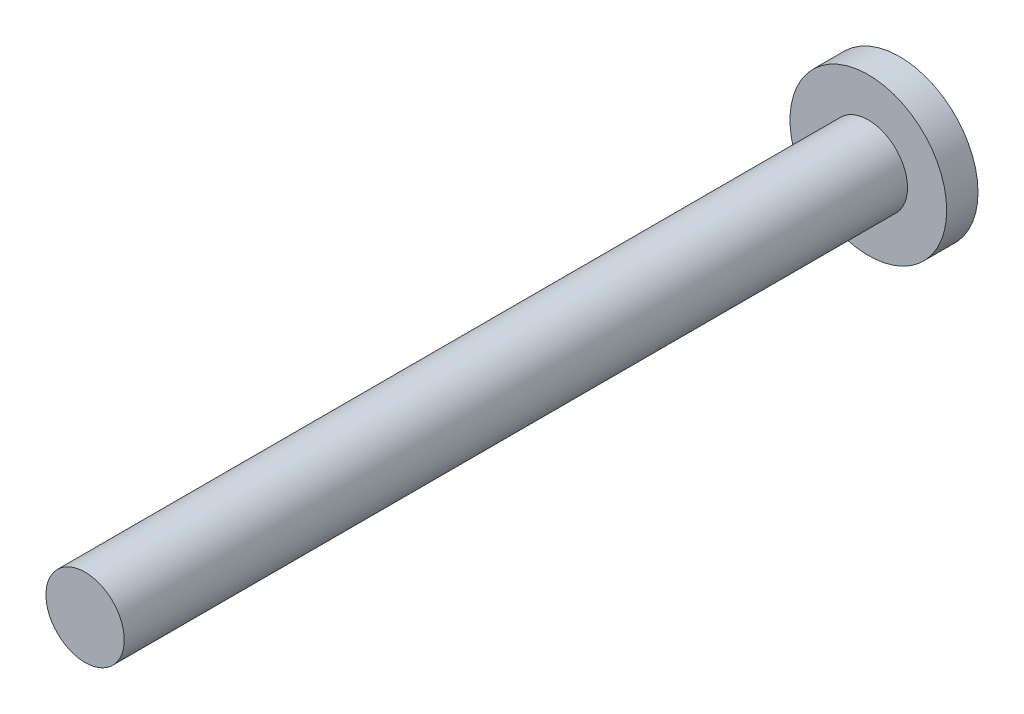
ISO-10303-21;
HEADER;
FILE_DESCRIPTION(('STEP AP214'),'2;1');
FILE_NAME('part.step','',(''),(''),'','','');
FILE_SCHEMA(('AUTOMOTIVE_DESIGN { 1 0 10303 214 1 1 1 1 }'));
ENDSEC;
DATA;
#1=APPLICATION_CONTEXT('core data for automotive mechanical design processes');
#2=APPLICATION_PROTOCOL_DEFINITION('international standard','automotive_design',2000,#1);
#3=PRODUCT_CONTEXT('',#1,'mechanical');
#4=PRODUCT('Part','Part','',(#3));
#5=PRODUCT_RELATED_PRODUCT_CATEGORY('part','',(#4));
#6=PRODUCT_DEFINITION_FORMATION('','',#4);
#7=PRODUCT_DEFINITION_CONTEXT('part definition',#1,'design');
#8=PRODUCT_DEFINITION('design','',#6,#7);
#9=PRODUCT_DEFINITION_SHAPE('','',#8);
#10=(LENGTH_UNIT() NAMED_UNIT(*) SI_UNIT(.MILLI.,.METRE.));
#11=(NAMED_UNIT(*) PLANE_ANGLE_UNIT() SI_UNIT($,.RADIAN.));
#12=(NAMED_UNIT(*) SI_UNIT($,.STERADIAN.) SOLID_ANGLE_UNIT());
#13=UNCERTAINTY_MEASURE_WITH_UNIT(LENGTH_MEASURE(1.E-05),#10,'distance_accuracy_value','');
#14=(GEOMETRIC_REPRESENTATION_CONTEXT(3) GLOBAL_UNCERTAINTY_ASSIGNED_CONTEXT((#13)) GLOBAL_UNIT_ASSIGNED_CONTEXT((#10,
#11,#12)) REPRESENTATION_CONTEXT('',''));
#15=CARTESIAN_POINT('',(0.,0.,0.));
#16=DIRECTION('',(0.,0.,1.));
#17=DIRECTION('',(1.,0.,0.));
#18=AXIS2_PLACEMENT_3D('',#15,#16,#17);
#19=CARTESIAN_POINT('',(2.5,0.,0.));
#20=DIRECTION('',(0.,0.,1.));
#21=DIRECTION('',(1.,0.,0.));
#22=AXIS2_PLACEMENT_3D('',#19,#20,#21);
#23=PLANE('',#22);
#24=CARTESIAN_POINT('',(0.,0.,0.));
#25=DIRECTION('',(0.,0.,1.));
#26=DIRECTION('',(1.,0.,0.));
#27=AXIS2_PLACEMENT_3D('',#24,#25,#26);
#28=CIRCLE('',#27,2.5);
#29=CARTESIAN_POINT('',(2.5,0.,0.));
#30=VERTEX_POINT('',#29);
#31=EDGE_CURVE('E45',#30,#30,#28,.T.);
#32=ORIENTED_EDGE('',*,*,#31,.T.);
#33=EDGE_LOOP('',(#32));
#34=FACE_BOUND('',#33,.T.);
#35=ADVANCED_FACE('F31',(#34),#23,.T.);
#36=CARTESIAN_POINT('',(0.,0.,-52.));
#37=DIRECTION('',(0.,0.,-1.));
#38=DIRECTION('',(-1.,0.,0.));
#39=AXIS2_PLACEMENT_3D('',#36,#37,#38);
#40=PLANE('',#39);
#41=CARTESIAN_POINT('',(0.,0.,-52.));
#42=DIRECTION('',(0.,0.,1.));
#43=DIRECTION('',(1.,0.,0.));
#44=AXIS2_PLACEMENT_3D('',#41,#42,#43);
#45=CIRCLE('',#44,5.);
#46=CARTESIAN_POINT('',(4.99999999999998,0.,-52.));
#47=VERTEX_POINT('',#46);
#48=EDGE_CURVE('E10',#47,#47,#45,.T.);
#49=ORIENTED_EDGE('',*,*,#48,.F.);
#50=EDGE_LOOP('',(#49));
#51=FACE_BOUND('',#50,.T.);
#52=ADVANCED_FACE('F63',(#51),#40,.T.);
#53=CARTESIAN_POINT('',(0.,0.,0.));
#54=DIRECTION('',(0.,0.,1.));
#55=DIRECTION('',(1.,0.,0.));
#56=AXIS2_PLACEMENT_3D('',#53,#54,#55);
#57=CYLINDRICAL_SURFACE('',#56,5.);
#58=ORIENTED_EDGE('',*,*,#48,.T.);
#59=EDGE_LOOP('',(#58));
#60=FACE_BOUND('',#59,.T.);
#61=CARTESIAN_POINT('',(0.,0.,-50.));
#62=DIRECTION('',(0.,0.,1.));
#63=DIRECTION('',(1.,0.,0.));
#64=AXIS2_PLACEMENT_3D('',#61,#62,#63);
#65=CIRCLE('',#64,5.);
#66=CARTESIAN_POINT('',(4.99999999999998,0.,-50.));
#67=VERTEX_POINT('',#66);
#68=EDGE_CURVE('E37',#67,#67,#65,.T.);
#69=ORIENTED_EDGE('',*,*,#68,.F.);
#70=EDGE_LOOP('',(#69));
#71=FACE_BOUND('',#70,.T.);
#72=ADVANCED_FACE('F60',(#60,#71),#57,.T.);
#73=CARTESIAN_POINT('',(4.99999999999998,0.,-50.));
#74=DIRECTION('',(0.,0.,1.));
#75=DIRECTION('',(1.,0.,0.));
#76=AXIS2_PLACEMENT_3D('',#73,#74,#75);
#77=PLANE('',#76);
#78=ORIENTED_EDGE('',*,*,#68,.T.);
#79=EDGE_LOOP('',(#78));
#80=FACE_BOUND('',#79,.T.);
#81=CARTESIAN_POINT('',(0.,0.,-50.));
#82=DIRECTION('',(0.,0.,1.));
#83=DIRECTION('',(1.,0.,0.));
#84=AXIS2_PLACEMENT_3D('',#81,#82,#83);
#85=CIRCLE('',#84,2.50000000000001);
#86=CARTESIAN_POINT('',(2.49999999999999,0.,-50.));
#87=VERTEX_POINT('',#86);
#88=EDGE_CURVE('E41',#87,#87,#85,.T.);
#89=ORIENTED_EDGE('',*,*,#88,.F.);
#90=EDGE_LOOP('',(#89));
#91=FACE_BOUND('',#90,.T.);
#92=ADVANCED_FACE('F54',(#80,#91),#77,.T.);
#93=CARTESIAN_POINT('',(0.,0.,0.));
#94=DIRECTION('',(0.,0.,1.));
#95=DIRECTION('',(1.,0.,0.));
#96=AXIS2_PLACEMENT_3D('',#93,#94,#95);
#97=CYLINDRICAL_SURFACE('',#96,2.50000000000001);
#98=ORIENTED_EDGE('',*,*,#88,.T.);
#99=EDGE_LOOP('',(#98));
#100=FACE_BOUND('',#99,.T.);
#101=ORIENTED_EDGE('',*,*,#31,.F.);
#102=EDGE_LOOP('',(#101));
#103=FACE_BOUND('',#102,.T.);
#104=ADVANCED_FACE('F52',(#100,#103),#97,.T.);
#105=CLOSED_SHELL('',(#35,#52,#72,#92,#104));
#106=MANIFOLD_SOLID_BREP('B2',#105);
#107=ADVANCED_BREP_SHAPE_REPRESENTATION('',(#18,#106),#14);
#108=SHAPE_DEFINITION_REPRESENTATION(#9,#107);
ENDSEC;
END-ISO-10303-21;
